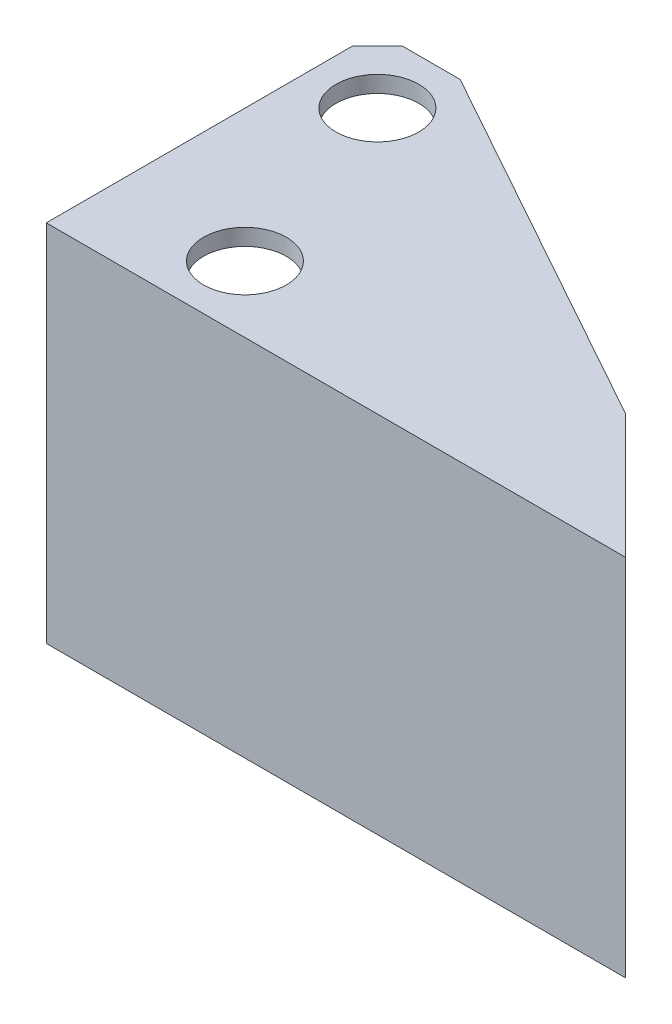
ISO-10303-21;
HEADER;
FILE_DESCRIPTION(('STEP AP214'),'2;1');
FILE_NAME('part.step','',(''),(''),'','','');
FILE_SCHEMA(('AUTOMOTIVE_DESIGN { 1 0 10303 214 1 1 1 1 }'));
ENDSEC;
DATA;
#1=APPLICATION_CONTEXT('core data for automotive mechanical design processes');
#2=APPLICATION_PROTOCOL_DEFINITION('international standard','automotive_design',2000,#1);
#3=PRODUCT_CONTEXT('',#1,'mechanical');
#4=PRODUCT('Part','Part','',(#3));
#5=PRODUCT_RELATED_PRODUCT_CATEGORY('part','',(#4));
#6=PRODUCT_DEFINITION_FORMATION('','',#4);
#7=PRODUCT_DEFINITION_CONTEXT('part definition',#1,'design');
#8=PRODUCT_DEFINITION('design','',#6,#7);
#9=PRODUCT_DEFINITION_SHAPE('','',#8);
#10=(LENGTH_UNIT() NAMED_UNIT(*) SI_UNIT(.MILLI.,.METRE.));
#11=(NAMED_UNIT(*) PLANE_ANGLE_UNIT() SI_UNIT($,.RADIAN.));
#12=(NAMED_UNIT(*) SI_UNIT($,.STERADIAN.) SOLID_ANGLE_UNIT());
#13=UNCERTAINTY_MEASURE_WITH_UNIT(LENGTH_MEASURE(1.E-05),#10,'distance_accuracy_value','');
#14=(GEOMETRIC_REPRESENTATION_CONTEXT(3) GLOBAL_UNCERTAINTY_ASSIGNED_CONTEXT((#13)) GLOBAL_UNIT_ASSIGNED_CONTEXT((#10,
#11,#12)) REPRESENTATION_CONTEXT('',''));
#15=CARTESIAN_POINT('',(0.,0.,0.));
#16=DIRECTION('',(0.,0.,1.));
#17=DIRECTION('',(1.,0.,0.));
#18=AXIS2_PLACEMENT_3D('',#15,#16,#17);
#19=CARTESIAN_POINT('',(0.,44.,-40.));
#20=DIRECTION('',(0.,0.,1.));
#21=DIRECTION('',(1.,0.,0.));
#22=AXIS2_PLACEMENT_3D('',#19,#20,#21);
#23=PLANE('',#22);
#24=DIRECTION('',(-1.,0.,0.));
#25=VECTOR('',#24,1.);
#26=CARTESIAN_POINT('',(0.,0.,-40.));
#27=LINE('',#26,#25);
#28=CARTESIAN_POINT('',(10.,0.,-40.));
#29=VERTEX_POINT('',#28);
#30=CARTESIAN_POINT('',(3.00000000000003,0.,-40.));
#31=VERTEX_POINT('',#30);
#32=EDGE_CURVE('E151',#29,#31,#27,.T.);
#33=ORIENTED_EDGE('',*,*,#32,.T.);
#34=DIRECTION('',(0.,1.,0.));
#35=VECTOR('',#34,1.);
#36=CARTESIAN_POINT('',(3.00000000000003,44.,-40.));
#37=LINE('',#36,#35);
#38=CARTESIAN_POINT('',(3.00000000000003,2.,-40.));
#39=VERTEX_POINT('',#38);
#40=EDGE_CURVE('E201',#31,#39,#37,.T.);
#41=ORIENTED_EDGE('',*,*,#40,.T.);
#42=DIRECTION('',(-1.,0.,0.));
#43=VECTOR('',#42,1.);
#44=CARTESIAN_POINT('',(70.,2.,-40.));
#45=LINE('',#44,#43);
#46=CARTESIAN_POINT('',(10.,2.,-40.));
#47=VERTEX_POINT('',#46);
#48=EDGE_CURVE('E154',#47,#39,#45,.T.);
#49=ORIENTED_EDGE('',*,*,#48,.F.);
#50=DIRECTION('',(0.,1.,0.));
#51=VECTOR('',#50,1.);
#52=CARTESIAN_POINT('',(10.,0.,-40.));
#53=LINE('',#52,#51);
#54=EDGE_CURVE('E136',#29,#47,#53,.T.);
#55=ORIENTED_EDGE('',*,*,#54,.F.);
#56=EDGE_LOOP('',(#33,#41,#49,#55));
#57=FACE_BOUND('',#56,.T.);
#58=ADVANCED_FACE('F41',(#57),#23,.F.);
#59=CARTESIAN_POINT('',(0.,44.,0.));
#60=DIRECTION('',(1.,0.,0.));
#61=DIRECTION('',(0.,0.,-1.));
#62=AXIS2_PLACEMENT_3D('',#59,#60,#61);
#63=PLANE('',#62);
#64=DIRECTION('',(0.,0.,1.));
#65=VECTOR('',#64,1.);
#66=CARTESIAN_POINT('',(0.,2.,-2.));
#67=LINE('',#66,#65);
#68=CARTESIAN_POINT('',(0.,2.,-37.));
#69=VERTEX_POINT('',#68);
#70=CARTESIAN_POINT('',(0.,2.,-2.));
#71=VERTEX_POINT('',#70);
#72=EDGE_CURVE('E270',#69,#71,#67,.T.);
#73=ORIENTED_EDGE('',*,*,#72,.F.);
#74=DIRECTION('',(0.,-1.,0.));
#75=VECTOR('',#74,1.);
#76=CARTESIAN_POINT('',(0.,44.,-37.));
#77=LINE('',#76,#75);
#78=CARTESIAN_POINT('',(0.,0.,-37.));
#79=VERTEX_POINT('',#78);
#80=EDGE_CURVE('E195',#69,#79,#77,.T.);
#81=ORIENTED_EDGE('',*,*,#80,.T.);
#82=DIRECTION('',(0.,0.,1.));
#83=VECTOR('',#82,1.);
#84=CARTESIAN_POINT('',(0.,0.,0.));
#85=LINE('',#84,#83);
#86=CARTESIAN_POINT('',(0.,0.,0.));
#87=VERTEX_POINT('',#86);
#88=EDGE_CURVE('E171',#79,#87,#85,.T.);
#89=ORIENTED_EDGE('',*,*,#88,.T.);
#90=DIRECTION('',(0.,-1.,0.));
#91=VECTOR('',#90,1.);
#92=CARTESIAN_POINT('',(0.,44.,0.));
#93=LINE('',#92,#91);
#94=CARTESIAN_POINT('',(0.,44.,0.));
#95=VERTEX_POINT('',#94);
#96=EDGE_CURVE('E178',#95,#87,#93,.T.);
#97=ORIENTED_EDGE('',*,*,#96,.F.);
#98=DIRECTION('',(0.,0.,1.));
#99=VECTOR('',#98,1.);
#100=CARTESIAN_POINT('',(0.,44.,0.));
#101=LINE('',#100,#99);
#102=CARTESIAN_POINT('',(0.,44.,-37.));
#103=VERTEX_POINT('',#102);
#104=EDGE_CURVE('E163',#103,#95,#101,.T.);
#105=ORIENTED_EDGE('',*,*,#104,.F.);
#106=DIRECTION('',(0.,-1.,0.));
#107=VECTOR('',#106,1.);
#108=CARTESIAN_POINT('',(0.,44.,-37.));
#109=LINE('',#108,#107);
#110=CARTESIAN_POINT('',(0.,42.,-37.));
#111=VERTEX_POINT('',#110);
#112=EDGE_CURVE('E191',#103,#111,#109,.T.);
#113=ORIENTED_EDGE('',*,*,#112,.T.);
#114=DIRECTION('',(0.,0.,-1.));
#115=VECTOR('',#114,1.);
#116=CARTESIAN_POINT('',(0.,42.,-2.));
#117=LINE('',#116,#115);
#118=CARTESIAN_POINT('',(0.,42.,-2.));
#119=VERTEX_POINT('',#118);
#120=EDGE_CURVE('E267',#119,#111,#117,.T.);
#121=ORIENTED_EDGE('',*,*,#120,.F.);
#122=DIRECTION('',(0.,1.,0.));
#123=VECTOR('',#122,1.);
#124=CARTESIAN_POINT('',(0.,2.,-2.));
#125=LINE('',#124,#123);
#126=EDGE_CURVE('E263',#71,#119,#125,.T.);
#127=ORIENTED_EDGE('',*,*,#126,.F.);
#128=EDGE_LOOP('',(#73,#81,#89,#97,#105,#113,#121,#127));
#129=FACE_BOUND('',#128,.T.);
#130=ADVANCED_FACE('F294',(#129),#63,.F.);
#131=CARTESIAN_POINT('',(0.,44.,0.));
#132=DIRECTION('',(0.,0.,-1.));
#133=DIRECTION('',(-1.,0.,0.));
#134=AXIS2_PLACEMENT_3D('',#131,#132,#133);
#135=PLANE('',#134);
#136=DIRECTION('',(1.,0.,0.));
#137=VECTOR('',#136,1.);
#138=CARTESIAN_POINT('',(0.,0.,0.));
#139=LINE('',#138,#137);
#140=CARTESIAN_POINT('',(70.,0.,0.));
#141=VERTEX_POINT('',#140);
#142=EDGE_CURVE('E164',#87,#141,#139,.T.);
#143=ORIENTED_EDGE('',*,*,#142,.T.);
#144=DIRECTION('',(0.,-1.,0.));
#145=VECTOR('',#144,1.);
#146=CARTESIAN_POINT('',(70.,44.,0.));
#147=LINE('',#146,#145);
#148=CARTESIAN_POINT('',(70.,44.,0.));
#149=VERTEX_POINT('',#148);
#150=EDGE_CURVE('E175',#149,#141,#147,.T.);
#151=ORIENTED_EDGE('',*,*,#150,.F.);
#152=DIRECTION('',(1.,0.,0.));
#153=VECTOR('',#152,1.);
#154=CARTESIAN_POINT('',(0.,44.,0.));
#155=LINE('',#154,#153);
#156=EDGE_CURVE('E168',#95,#149,#155,.T.);
#157=ORIENTED_EDGE('',*,*,#156,.F.);
#158=ORIENTED_EDGE('',*,*,#96,.T.);
#159=EDGE_LOOP('',(#143,#151,#157,#158));
#160=FACE_BOUND('',#159,.T.);
#161=ADVANCED_FACE('F300',(#160),#135,.F.);
#162=DIRECTION('',(-1.,0.,0.));
#163=VECTOR('',#162,1.);
#164=CARTESIAN_POINT('',(70.,42.,-40.));
#165=LINE('',#164,#163);
#166=CARTESIAN_POINT('',(10.,42.,-40.));
#167=VERTEX_POINT('',#166);
#168=CARTESIAN_POINT('',(3.00000000000003,42.,-40.));
#169=VERTEX_POINT('',#168);
#170=EDGE_CURVE('E280',#167,#169,#165,.T.);
#171=ORIENTED_EDGE('',*,*,#170,.T.);
#172=DIRECTION('',(0.,1.,0.));
#173=VECTOR('',#172,1.);
#174=CARTESIAN_POINT('',(3.00000000000003,44.,-40.));
#175=LINE('',#174,#173);
#176=CARTESIAN_POINT('',(3.00000000000003,44.,-40.));
#177=VERTEX_POINT('',#176);
#178=EDGE_CURVE('E52',#169,#177,#175,.T.);
#179=ORIENTED_EDGE('',*,*,#178,.T.);
#180=DIRECTION('',(-1.,0.,0.));
#181=VECTOR('',#180,1.);
#182=CARTESIAN_POINT('',(0.,44.,-40.));
#183=LINE('',#182,#181);
#184=CARTESIAN_POINT('',(10.,44.,-40.));
#185=VERTEX_POINT('',#184);
#186=EDGE_CURVE('E179',#185,#177,#183,.T.);
#187=ORIENTED_EDGE('',*,*,#186,.F.);
#188=EDGE_CURVE('E157',#167,#185,#53,.T.);
#189=ORIENTED_EDGE('',*,*,#188,.F.);
#190=EDGE_LOOP('',(#171,#179,#187,#189));
#191=FACE_BOUND('',#190,.T.);
#192=ADVANCED_FACE('F324',(#191),#23,.F.);
#193=CARTESIAN_POINT('',(0.,44.,0.));
#194=DIRECTION('',(0.,-1.,0.));
#195=DIRECTION('',(0.,0.,-1.));
#196=AXIS2_PLACEMENT_3D('',#193,#194,#195);
#197=PLANE('',#196);
#198=CARTESIAN_POINT('',(8.,44.,-32.));
#199=DIRECTION('',(0.,1.,0.));
#200=DIRECTION('',(0.,0.,1.));
#201=AXIS2_PLACEMENT_3D('',#198,#199,#200);
#202=CIRCLE('',#201,5.);
#203=CARTESIAN_POINT('',(8.,44.,-27.));
#204=VERTEX_POINT('',#203);
#205=EDGE_CURVE('E222',#204,#204,#202,.T.);
#206=ORIENTED_EDGE('',*,*,#205,.F.);
#207=EDGE_LOOP('',(#206));
#208=FACE_BOUND('',#207,.T.);
#209=CARTESIAN_POINT('',(16.,44.,-8.));
#210=DIRECTION('',(0.,1.,0.));
#211=DIRECTION('',(0.,0.,1.));
#212=AXIS2_PLACEMENT_3D('',#209,#210,#211);
#213=CIRCLE('',#212,5.);
#214=CARTESIAN_POINT('',(16.,44.,-3.));
#215=VERTEX_POINT('',#214);
#216=EDGE_CURVE('E234',#215,#215,#213,.T.);
#217=ORIENTED_EDGE('',*,*,#216,.F.);
#218=EDGE_LOOP('',(#217));
#219=FACE_BOUND('',#218,.T.);
#220=ORIENTED_EDGE('',*,*,#186,.T.);
#221=DIRECTION('',(0.707106781186551,0.,-0.707106781186544));
#222=VECTOR('',#221,1.);
#223=CARTESIAN_POINT('',(0.,44.,-37.));
#224=LINE('',#223,#222);
#225=EDGE_CURVE('E11',#177,#103,#224,.F.);
#226=ORIENTED_EDGE('',*,*,#225,.T.);
#227=ORIENTED_EDGE('',*,*,#104,.T.);
#228=ORIENTED_EDGE('',*,*,#156,.T.);
#229=DIRECTION('',(0.707106781186547,0.,0.707106781186547));
#230=VECTOR('',#229,1.);
#231=CARTESIAN_POINT('',(55.,44.,-15.));
#232=LINE('',#231,#230);
#233=CARTESIAN_POINT('',(55.,44.,-15.));
#234=VERTEX_POINT('',#233);
#235=EDGE_CURVE('E146',#234,#149,#232,.T.);
#236=ORIENTED_EDGE('',*,*,#235,.F.);
#237=DIRECTION('',(0.874157276121538,0.,0.485642931178632));
#238=VECTOR('',#237,1.);
#239=CARTESIAN_POINT('',(10.,44.,-40.));
#240=LINE('',#239,#238);
#241=EDGE_CURVE('E241',#185,#234,#240,.T.);
#242=ORIENTED_EDGE('',*,*,#241,.F.);
#243=EDGE_LOOP('',(#220,#226,#227,#228,#236,#242));
#244=FACE_BOUND('',#243,.T.);
#245=ADVANCED_FACE('F303',(#208,#219,#244),#197,.F.);
#246=CARTESIAN_POINT('',(0.,0.,0.));
#247=DIRECTION('',(0.,-1.,0.));
#248=DIRECTION('',(0.,0.,-1.));
#249=AXIS2_PLACEMENT_3D('',#246,#247,#248);
#250=PLANE('',#249);
#251=CARTESIAN_POINT('',(8.,0.,-32.));
#252=DIRECTION('',(0.,1.,0.));
#253=DIRECTION('',(0.,0.,1.));
#254=AXIS2_PLACEMENT_3D('',#251,#252,#253);
#255=CIRCLE('',#254,5.);
#256=CARTESIAN_POINT('',(8.,0.,-27.));
#257=VERTEX_POINT('',#256);
#258=EDGE_CURVE('E214',#257,#257,#255,.T.);
#259=ORIENTED_EDGE('',*,*,#258,.T.);
#260=EDGE_LOOP('',(#259));
#261=FACE_BOUND('',#260,.T.);
#262=CARTESIAN_POINT('',(16.,0.,-8.));
#263=DIRECTION('',(0.,1.,0.));
#264=DIRECTION('',(0.,0.,1.));
#265=AXIS2_PLACEMENT_3D('',#262,#263,#264);
#266=CIRCLE('',#265,5.);
#267=CARTESIAN_POINT('',(16.,0.,-3.));
#268=VERTEX_POINT('',#267);
#269=EDGE_CURVE('E228',#268,#268,#266,.T.);
#270=ORIENTED_EDGE('',*,*,#269,.T.);
#271=EDGE_LOOP('',(#270));
#272=FACE_BOUND('',#271,.T.);
#273=ORIENTED_EDGE('',*,*,#88,.F.);
#274=DIRECTION('',(-0.707106781186551,0.,0.707106781186544));
#275=VECTOR('',#274,1.);
#276=CARTESIAN_POINT('',(-18.5,0.,-18.5000000000002));
#277=LINE('',#276,#275);
#278=EDGE_CURVE('E161',#79,#31,#277,.F.);
#279=ORIENTED_EDGE('',*,*,#278,.T.);
#280=ORIENTED_EDGE('',*,*,#32,.F.);
#281=DIRECTION('',(0.874157276121538,0.,0.485642931178632));
#282=VECTOR('',#281,1.);
#283=CARTESIAN_POINT('',(10.,0.,-40.));
#284=LINE('',#283,#282);
#285=CARTESIAN_POINT('',(55.,0.,-15.));
#286=VERTEX_POINT('',#285);
#287=EDGE_CURVE('E133',#29,#286,#284,.T.);
#288=ORIENTED_EDGE('',*,*,#287,.T.);
#289=DIRECTION('',(0.707106781186547,0.,0.707106781186547));
#290=VECTOR('',#289,1.);
#291=CARTESIAN_POINT('',(55.,0.,-15.));
#292=LINE('',#291,#290);
#293=EDGE_CURVE('E145',#286,#141,#292,.T.);
#294=ORIENTED_EDGE('',*,*,#293,.T.);
#295=ORIENTED_EDGE('',*,*,#142,.F.);
#296=EDGE_LOOP('',(#273,#279,#280,#288,#294,#295));
#297=FACE_BOUND('',#296,.T.);
#298=ADVANCED_FACE('F160',(#261,#272,#297),#250,.T.);
#299=CARTESIAN_POINT('',(70.,2.,-2.));
#300=DIRECTION('',(0.,0.,1.));
#301=DIRECTION('',(1.,0.,0.));
#302=AXIS2_PLACEMENT_3D('',#299,#300,#301);
#303=PLANE('',#302);
#304=DIRECTION('',(-1.,0.,0.));
#305=VECTOR('',#304,1.);
#306=CARTESIAN_POINT('',(70.,42.,-2.));
#307=LINE('',#306,#305);
#308=CARTESIAN_POINT('',(68.,42.,-2.));
#309=VERTEX_POINT('',#308);
#310=EDGE_CURVE('E273',#309,#119,#307,.T.);
#311=ORIENTED_EDGE('',*,*,#310,.F.);
#312=DIRECTION('',(0.,-1.,0.));
#313=VECTOR('',#312,1.);
#314=CARTESIAN_POINT('',(68.,2.,-2.));
#315=LINE('',#314,#313);
#316=CARTESIAN_POINT('',(68.,2.,-2.));
#317=VERTEX_POINT('',#316);
#318=EDGE_CURVE('E255',#309,#317,#315,.T.);
#319=ORIENTED_EDGE('',*,*,#318,.T.);
#320=DIRECTION('',(-1.,0.,0.));
#321=VECTOR('',#320,1.);
#322=CARTESIAN_POINT('',(70.,2.,-2.));
#323=LINE('',#322,#321);
#324=EDGE_CURVE('E274',#317,#71,#323,.T.);
#325=ORIENTED_EDGE('',*,*,#324,.T.);
#326=ORIENTED_EDGE('',*,*,#126,.T.);
#327=EDGE_LOOP('',(#311,#319,#325,#326));
#328=FACE_BOUND('',#327,.T.);
#329=ADVANCED_FACE('F348',(#328),#303,.F.);
#330=CARTESIAN_POINT('',(70.,2.,-2.));
#331=DIRECTION('',(0.,-1.,0.));
#332=DIRECTION('',(0.,0.,-1.));
#333=AXIS2_PLACEMENT_3D('',#330,#331,#332);
#334=PLANE('',#333);
#335=CARTESIAN_POINT('',(8.,2.,-32.));
#336=DIRECTION('',(0.,-1.,0.));
#337=DIRECTION('',(0.,0.,-1.));
#338=AXIS2_PLACEMENT_3D('',#335,#336,#337);
#339=CIRCLE('',#338,5.);
#340=CARTESIAN_POINT('',(8.,2.,-37.));
#341=VERTEX_POINT('',#340);
#342=EDGE_CURVE('E238',#341,#341,#339,.T.);
#343=ORIENTED_EDGE('',*,*,#342,.T.);
#344=EDGE_LOOP('',(#343));
#345=FACE_BOUND('',#344,.T.);
#346=CARTESIAN_POINT('',(16.,2.,-8.));
#347=DIRECTION('',(0.,-1.,0.));
#348=DIRECTION('',(0.,0.,-1.));
#349=AXIS2_PLACEMENT_3D('',#346,#347,#348);
#350=CIRCLE('',#349,5.);
#351=CARTESIAN_POINT('',(16.,2.,-13.));
#352=VERTEX_POINT('',#351);
#353=EDGE_CURVE('E213',#352,#352,#350,.T.);
#354=ORIENTED_EDGE('',*,*,#353,.T.);
#355=EDGE_LOOP('',(#354));
#356=FACE_BOUND('',#355,.T.);
#357=ORIENTED_EDGE('',*,*,#48,.T.);
#358=DIRECTION('',(0.707106781186551,0.,-0.707106781186544));
#359=VECTOR('',#358,1.);
#360=CARTESIAN_POINT('',(0.,1.99999999999999,-37.));
#361=LINE('',#360,#359);
#362=EDGE_CURVE('E204',#39,#69,#361,.F.);
#363=ORIENTED_EDGE('',*,*,#362,.T.);
#364=ORIENTED_EDGE('',*,*,#72,.T.);
#365=ORIENTED_EDGE('',*,*,#324,.F.);
#366=DIRECTION('',(-0.707106781186548,0.,-0.707106781186548));
#367=VECTOR('',#366,1.);
#368=CARTESIAN_POINT('',(69.,2.,-1.));
#369=LINE('',#368,#367);
#370=CARTESIAN_POINT('',(55.,2.,-15.));
#371=VERTEX_POINT('',#370);
#372=EDGE_CURVE('E259',#317,#371,#369,.T.);
#373=ORIENTED_EDGE('',*,*,#372,.T.);
#374=DIRECTION('',(-0.874157276121538,0.,-0.485642931178632));
#375=VECTOR('',#374,1.);
#376=CARTESIAN_POINT('',(71.9811320754717,2.,-5.56603773584906));
#377=LINE('',#376,#375);
#378=EDGE_CURVE('E251',#371,#47,#377,.T.);
#379=ORIENTED_EDGE('',*,*,#378,.T.);
#380=EDGE_LOOP('',(#357,#363,#364,#365,#373,#379));
#381=FACE_BOUND('',#380,.T.);
#382=ADVANCED_FACE('F351',(#345,#356,#381),#334,.F.);
#383=CARTESIAN_POINT('',(70.,42.,-2.));
#384=DIRECTION('',(0.,1.,0.));
#385=DIRECTION('',(0.,0.,1.));
#386=AXIS2_PLACEMENT_3D('',#383,#384,#385);
#387=PLANE('',#386);
#388=CARTESIAN_POINT('',(8.,42.,-32.));
#389=DIRECTION('',(0.,1.,0.));
#390=DIRECTION('',(0.,0.,1.));
#391=AXIS2_PLACEMENT_3D('',#388,#389,#390);
#392=CIRCLE('',#391,5.);
#393=CARTESIAN_POINT('',(8.,42.,-27.));
#394=VERTEX_POINT('',#393);
#395=EDGE_CURVE('E46',#394,#394,#392,.T.);
#396=ORIENTED_EDGE('',*,*,#395,.T.);
#397=EDGE_LOOP('',(#396));
#398=FACE_BOUND('',#397,.T.);
#399=CARTESIAN_POINT('',(16.,42.,-8.));
#400=DIRECTION('',(0.,1.,0.));
#401=DIRECTION('',(0.,0.,1.));
#402=AXIS2_PLACEMENT_3D('',#399,#400,#401);
#403=CIRCLE('',#402,5.);
#404=CARTESIAN_POINT('',(16.,42.,-3.));
#405=VERTEX_POINT('',#404);
#406=EDGE_CURVE('E210',#405,#405,#403,.T.);
#407=ORIENTED_EDGE('',*,*,#406,.T.);
#408=EDGE_LOOP('',(#407));
#409=FACE_BOUND('',#408,.T.);
#410=ORIENTED_EDGE('',*,*,#120,.T.);
#411=DIRECTION('',(-0.707106781186551,0.,0.707106781186544));
#412=VECTOR('',#411,1.);
#413=CARTESIAN_POINT('',(0.,42.,-37.));
#414=LINE('',#413,#412);
#415=EDGE_CURVE('E67',#111,#169,#414,.F.);
#416=ORIENTED_EDGE('',*,*,#415,.T.);
#417=ORIENTED_EDGE('',*,*,#170,.F.);
#418=DIRECTION('',(0.874157276121538,0.,0.485642931178632));
#419=VECTOR('',#418,1.);
#420=CARTESIAN_POINT('',(71.9811320754717,42.,-5.56603773584906));
#421=LINE('',#420,#419);
#422=CARTESIAN_POINT('',(55.,42.,-15.));
#423=VERTEX_POINT('',#422);
#424=EDGE_CURVE('E183',#167,#423,#421,.T.);
#425=ORIENTED_EDGE('',*,*,#424,.T.);
#426=DIRECTION('',(0.707106781186548,0.,0.707106781186548));
#427=VECTOR('',#426,1.);
#428=CARTESIAN_POINT('',(69.,42.,-1.));
#429=LINE('',#428,#427);
#430=EDGE_CURVE('E187',#423,#309,#429,.T.);
#431=ORIENTED_EDGE('',*,*,#430,.T.);
#432=ORIENTED_EDGE('',*,*,#310,.T.);
#433=EDGE_LOOP('',(#410,#416,#417,#425,#431,#432));
#434=FACE_BOUND('',#433,.T.);
#435=ADVANCED_FACE('F339',(#398,#409,#434),#387,.F.);
#436=CARTESIAN_POINT('',(55.,0.,-15.));
#437=DIRECTION('',(-0.707106781186548,0.,0.707106781186548));
#438=DIRECTION('',(0.707106781186548,0.,0.707106781186548));
#439=AXIS2_PLACEMENT_3D('',#436,#437,#438);
#440=PLANE('',#439);
#441=ORIENTED_EDGE('',*,*,#318,.F.);
#442=ORIENTED_EDGE('',*,*,#430,.F.);
#443=DIRECTION('',(0.,1.,0.));
#444=VECTOR('',#443,1.);
#445=CARTESIAN_POINT('',(55.,0.,-15.));
#446=LINE('',#445,#444);
#447=EDGE_CURVE('E156',#423,#234,#446,.T.);
#448=ORIENTED_EDGE('',*,*,#447,.T.);
#449=ORIENTED_EDGE('',*,*,#235,.T.);
#450=ORIENTED_EDGE('',*,*,#150,.T.);
#451=ORIENTED_EDGE('',*,*,#293,.F.);
#452=EDGE_CURVE('E139',#286,#371,#446,.T.);
#453=ORIENTED_EDGE('',*,*,#452,.T.);
#454=ORIENTED_EDGE('',*,*,#372,.F.);
#455=EDGE_LOOP('',(#441,#442,#448,#449,#450,#451,#453,#454));
#456=FACE_BOUND('',#455,.T.);
#457=ADVANCED_FACE('F345',(#456),#440,.F.);
#458=CARTESIAN_POINT('',(10.,0.,-40.));
#459=DIRECTION('',(-0.485642931178632,0.,0.874157276121538));
#460=DIRECTION('',(0.874157276121538,0.,0.485642931178632));
#461=AXIS2_PLACEMENT_3D('',#458,#459,#460);
#462=PLANE('',#461);
#463=ORIENTED_EDGE('',*,*,#452,.F.);
#464=ORIENTED_EDGE('',*,*,#287,.F.);
#465=ORIENTED_EDGE('',*,*,#54,.T.);
#466=ORIENTED_EDGE('',*,*,#378,.F.);
#467=EDGE_LOOP('',(#463,#464,#465,#466));
#468=FACE_BOUND('',#467,.T.);
#469=ADVANCED_FACE('F135',(#468),#462,.F.);
#470=ORIENTED_EDGE('',*,*,#188,.T.);
#471=ORIENTED_EDGE('',*,*,#241,.T.);
#472=ORIENTED_EDGE('',*,*,#447,.F.);
#473=ORIENTED_EDGE('',*,*,#424,.F.);
#474=EDGE_LOOP('',(#470,#471,#472,#473));
#475=FACE_BOUND('',#474,.T.);
#476=ADVANCED_FACE('F320',(#475),#462,.F.);
#477=CARTESIAN_POINT('',(0.,44.,-37.));
#478=DIRECTION('',(0.707106781186544,0.,0.707106781186551));
#479=DIRECTION('',(0.,-1.,0.));
#480=AXIS2_PLACEMENT_3D('',#477,#478,#479);
#481=PLANE('',#480);
#482=ORIENTED_EDGE('',*,*,#362,.F.);
#483=ORIENTED_EDGE('',*,*,#40,.F.);
#484=ORIENTED_EDGE('',*,*,#278,.F.);
#485=ORIENTED_EDGE('',*,*,#80,.F.);
#486=EDGE_LOOP('',(#482,#483,#484,#485));
#487=FACE_BOUND('',#486,.T.);
#488=ADVANCED_FACE('F311',(#487),#481,.F.);
#489=CARTESIAN_POINT('',(0.,44.,-37.));
#490=DIRECTION('',(0.707106781186544,0.,0.707106781186551));
#491=DIRECTION('',(0.,-1.,0.));
#492=AXIS2_PLACEMENT_3D('',#489,#490,#491);
#493=PLANE('',#492);
#494=ORIENTED_EDGE('',*,*,#225,.F.);
#495=ORIENTED_EDGE('',*,*,#178,.F.);
#496=ORIENTED_EDGE('',*,*,#415,.F.);
#497=ORIENTED_EDGE('',*,*,#112,.F.);
#498=EDGE_LOOP('',(#494,#495,#496,#497));
#499=FACE_BOUND('',#498,.T.);
#500=ADVANCED_FACE('F44',(#499),#493,.F.);
#501=CARTESIAN_POINT('',(16.,0.,-8.));
#502=DIRECTION('',(0.,1.,0.));
#503=DIRECTION('',(0.,0.,1.));
#504=AXIS2_PLACEMENT_3D('',#501,#502,#503);
#505=CYLINDRICAL_SURFACE('',#504,5.);
#506=ORIENTED_EDGE('',*,*,#216,.T.);
#507=EDGE_LOOP('',(#506));
#508=FACE_BOUND('',#507,.T.);
#509=ORIENTED_EDGE('',*,*,#406,.F.);
#510=EDGE_LOOP('',(#509));
#511=FACE_BOUND('',#510,.T.);
#512=ADVANCED_FACE('F310',(#508,#511),#505,.F.);
#513=CARTESIAN_POINT('',(8.,0.,-32.));
#514=DIRECTION('',(0.,1.,0.));
#515=DIRECTION('',(0.,0.,1.));
#516=AXIS2_PLACEMENT_3D('',#513,#514,#515);
#517=CYLINDRICAL_SURFACE('',#516,5.);
#518=ORIENTED_EDGE('',*,*,#205,.T.);
#519=EDGE_LOOP('',(#518));
#520=FACE_BOUND('',#519,.T.);
#521=ORIENTED_EDGE('',*,*,#395,.F.);
#522=EDGE_LOOP('',(#521));
#523=FACE_BOUND('',#522,.T.);
#524=ADVANCED_FACE('F316',(#520,#523),#517,.F.);
#525=ORIENTED_EDGE('',*,*,#269,.F.);
#526=EDGE_LOOP('',(#525));
#527=FACE_BOUND('',#526,.T.);
#528=ORIENTED_EDGE('',*,*,#353,.F.);
#529=EDGE_LOOP('',(#528));
#530=FACE_BOUND('',#529,.T.);
#531=ADVANCED_FACE('F319',(#527,#530),#505,.F.);
#532=ORIENTED_EDGE('',*,*,#258,.F.);
#533=EDGE_LOOP('',(#532));
#534=FACE_BOUND('',#533,.T.);
#535=ORIENTED_EDGE('',*,*,#342,.F.);
#536=EDGE_LOOP('',(#535));
#537=FACE_BOUND('',#536,.T.);
#538=ADVANCED_FACE('F374',(#534,#537),#517,.F.);
#539=CLOSED_SHELL('',(#58,#130,#161,#192,#245,#298,#329,#382,#435,#457,#469,#476,#488,#500,#512,
#524,#531,#538));
#540=MANIFOLD_SOLID_BREP('B2',#539);
#541=ADVANCED_BREP_SHAPE_REPRESENTATION('',(#18,#540),#14);
#542=SHAPE_DEFINITION_REPRESENTATION(#9,#541);
ENDSEC;
END-ISO-10303-21;
